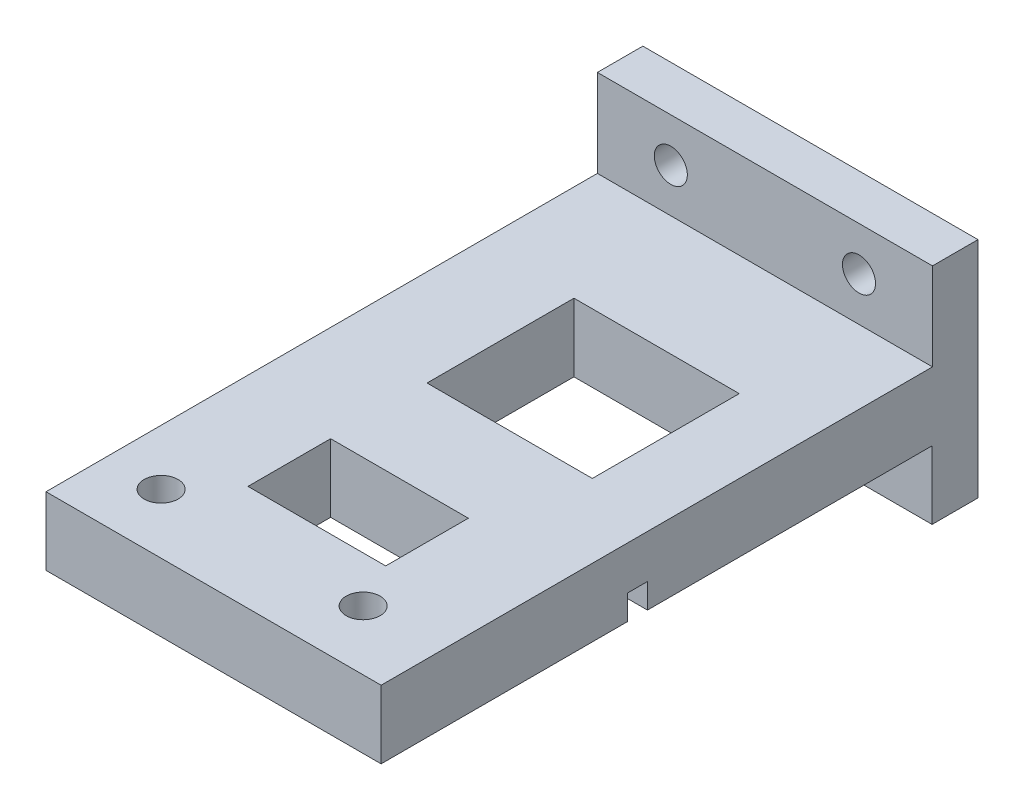
ISO-10303-21;
HEADER;
FILE_DESCRIPTION(('STEP AP214'),'2;1');
FILE_NAME('part.step','',(''),(''),'','','');
FILE_SCHEMA(('AUTOMOTIVE_DESIGN { 1 0 10303 214 1 1 1 1 }'));
ENDSEC;
DATA;
#1=APPLICATION_CONTEXT('core data for automotive mechanical design processes');
#2=APPLICATION_PROTOCOL_DEFINITION('international standard','automotive_design',2000,#1);
#3=PRODUCT_CONTEXT('',#1,'mechanical');
#4=PRODUCT('Part','Part','',(#3));
#5=PRODUCT_RELATED_PRODUCT_CATEGORY('part','',(#4));
#6=PRODUCT_DEFINITION_FORMATION('','',#4);
#7=PRODUCT_DEFINITION_CONTEXT('part definition',#1,'design');
#8=PRODUCT_DEFINITION('design','',#6,#7);
#9=PRODUCT_DEFINITION_SHAPE('','',#8);
#10=(LENGTH_UNIT() NAMED_UNIT(*) SI_UNIT(.MILLI.,.METRE.));
#11=(NAMED_UNIT(*) PLANE_ANGLE_UNIT() SI_UNIT($,.RADIAN.));
#12=(NAMED_UNIT(*) SI_UNIT($,.STERADIAN.) SOLID_ANGLE_UNIT());
#13=UNCERTAINTY_MEASURE_WITH_UNIT(LENGTH_MEASURE(1.E-05),#10,'distance_accuracy_value','');
#14=(GEOMETRIC_REPRESENTATION_CONTEXT(3) GLOBAL_UNCERTAINTY_ASSIGNED_CONTEXT((#13)) GLOBAL_UNIT_ASSIGNED_CONTEXT((#10,
#11,#12)) REPRESENTATION_CONTEXT('',''));
#15=CARTESIAN_POINT('',(0.,0.,0.));
#16=DIRECTION('',(0.,0.,1.));
#17=DIRECTION('',(1.,0.,0.));
#18=AXIS2_PLACEMENT_3D('',#15,#16,#17);
#19=CARTESIAN_POINT('',(0.,0.,29.7));
#20=DIRECTION('',(0.,0.,1.));
#21=DIRECTION('',(1.,0.,0.));
#22=AXIS2_PLACEMENT_3D('',#19,#20,#21);
#23=PLANE('',#22);
#24=DIRECTION('',(-1.,0.,0.));
#25=VECTOR('',#24,1.);
#26=CARTESIAN_POINT('',(-6.61487977012399,-135.86462945309,29.7));
#27=LINE('',#26,#25);
#28=CARTESIAN_POINT('',(29.8795748109975,-135.86462945309,29.7));
#29=VERTEX_POINT('',#28);
#30=CARTESIAN_POINT('',(-6.61487977012399,-135.86462945309,29.7));
#31=VERTEX_POINT('',#30);
#32=EDGE_CURVE('E333',#29,#31,#27,.T.);
#33=ORIENTED_EDGE('',*,*,#32,.F.);
#34=DIRECTION('',(0.,1.,0.));
#35=VECTOR('',#34,1.);
#36=CARTESIAN_POINT('',(29.8795748109975,-135.86462945309,29.7));
#37=LINE('',#36,#35);
#38=CARTESIAN_POINT('',(29.8795748109975,-150.703034062997,29.7));
#39=VERTEX_POINT('',#38);
#40=EDGE_CURVE('E336',#39,#29,#37,.T.);
#41=ORIENTED_EDGE('',*,*,#40,.F.);
#42=DIRECTION('',(1.,0.,0.));
#43=VECTOR('',#42,1.);
#44=CARTESIAN_POINT('',(-6.61487977012399,-150.703034062997,29.7));
#45=LINE('',#44,#43);
#46=CARTESIAN_POINT('',(-6.61487977012399,-150.703034062997,29.7));
#47=VERTEX_POINT('',#46);
#48=EDGE_CURVE('E340',#47,#39,#45,.T.);
#49=ORIENTED_EDGE('',*,*,#48,.F.);
#50=DIRECTION('',(0.,-1.,0.));
#51=VECTOR('',#50,1.);
#52=CARTESIAN_POINT('',(-6.61487977012399,-135.86462945309,29.7));
#53=LINE('',#52,#51);
#54=EDGE_CURVE('E343',#31,#47,#53,.T.);
#55=ORIENTED_EDGE('',*,*,#54,.F.);
#56=EDGE_LOOP('',(#33,#41,#49,#55));
#57=FACE_BOUND('',#56,.T.);
#58=ADVANCED_FACE('F38',(#57),#23,.F.);
#59=CARTESIAN_POINT('',(-6.61487977012399,-135.86462945309,74.0957290393366));
#60=DIRECTION('',(0.,-1.,0.));
#61=DIRECTION('',(0.,0.,-1.));
#62=AXIS2_PLACEMENT_3D('',#59,#60,#61);
#63=PLANE('',#62);
#64=CARTESIAN_POINT('',(21.4220309120393,-135.86462945309,88.2));
#65=DIRECTION('',(0.,-1.,0.));
#66=DIRECTION('',(0.,0.,-1.));
#67=AXIS2_PLACEMENT_3D('',#64,#65,#66);
#68=CIRCLE('',#67,1.85);
#69=CARTESIAN_POINT('',(21.4220309120393,-135.86462945309,86.35));
#70=VERTEX_POINT('',#69);
#71=EDGE_CURVE('E287',#70,#70,#68,.T.);
#72=ORIENTED_EDGE('',*,*,#71,.T.);
#73=EDGE_LOOP('',(#72));
#74=FACE_BOUND('',#73,.T.);
#75=CARTESIAN_POINT('',(-0.577969087960695,-135.86462945309,88.2));
#76=DIRECTION('',(0.,-1.,0.));
#77=DIRECTION('',(0.,0.,-1.));
#78=AXIS2_PLACEMENT_3D('',#75,#76,#77);
#79=CIRCLE('',#78,1.85);
#80=CARTESIAN_POINT('',(-0.577969087960695,-135.86462945309,86.35));
#81=VERTEX_POINT('',#80);
#82=EDGE_CURVE('E293',#81,#81,#79,.T.);
#83=ORIENTED_EDGE('',*,*,#82,.T.);
#84=EDGE_LOOP('',(#83));
#85=FACE_BOUND('',#84,.T.);
#86=DIRECTION('',(-1.,0.,0.));
#87=VECTOR('',#86,1.);
#88=CARTESIAN_POINT('',(3.87957481099747,-135.86462945309,47.7000000000001));
#89=LINE('',#88,#87);
#90=CARTESIAN_POINT('',(21.8795748109975,-135.86462945309,47.7000000000001));
#91=VERTEX_POINT('',#90);
#92=CARTESIAN_POINT('',(3.87957481099747,-135.86462945309,47.7000000000001));
#93=VERTEX_POINT('',#92);
#94=EDGE_CURVE('E255',#91,#93,#89,.T.);
#95=ORIENTED_EDGE('',*,*,#94,.F.);
#96=DIRECTION('',(0.,0.,-1.));
#97=VECTOR('',#96,1.);
#98=CARTESIAN_POINT('',(21.8795748109975,-135.86462945309,47.7000000000001));
#99=LINE('',#98,#97);
#100=CARTESIAN_POINT('',(21.8795748109975,-135.86462945309,63.7000000000001));
#101=VERTEX_POINT('',#100);
#102=EDGE_CURVE('E231',#101,#91,#99,.T.);
#103=ORIENTED_EDGE('',*,*,#102,.F.);
#104=DIRECTION('',(1.,0.,0.));
#105=VECTOR('',#104,1.);
#106=CARTESIAN_POINT('',(3.87957481099747,-135.86462945309,63.7000000000001));
#107=LINE('',#106,#105);
#108=CARTESIAN_POINT('',(3.87957481099747,-135.86462945309,63.7000000000001));
#109=VERTEX_POINT('',#108);
#110=EDGE_CURVE('E261',#109,#101,#107,.T.);
#111=ORIENTED_EDGE('',*,*,#110,.F.);
#112=DIRECTION('',(0.,0.,1.));
#113=VECTOR('',#112,1.);
#114=CARTESIAN_POINT('',(3.87957481099747,-135.86462945309,47.7000000000001));
#115=LINE('',#114,#113);
#116=EDGE_CURVE('E258',#93,#109,#115,.T.);
#117=ORIENTED_EDGE('',*,*,#116,.F.);
#118=EDGE_LOOP('',(#95,#103,#111,#117));
#119=FACE_BOUND('',#118,.T.);
#120=DIRECTION('',(-1.,0.,0.));
#121=VECTOR('',#120,1.);
#122=CARTESIAN_POINT('',(3.87957481099747,-135.86462945309,74.2000000000001));
#123=LINE('',#122,#121);
#124=CARTESIAN_POINT('',(18.8795748109975,-135.86462945309,74.2000000000001));
#125=VERTEX_POINT('',#124);
#126=CARTESIAN_POINT('',(3.87957481099747,-135.86462945309,74.2000000000001));
#127=VERTEX_POINT('',#126);
#128=EDGE_CURVE('E234',#125,#127,#123,.T.);
#129=ORIENTED_EDGE('',*,*,#128,.F.);
#130=DIRECTION('',(0.,0.,-1.));
#131=VECTOR('',#130,1.);
#132=CARTESIAN_POINT('',(18.8795748109975,-135.86462945309,74.2000000000001));
#133=LINE('',#132,#131);
#134=CARTESIAN_POINT('',(18.8795748109975,-135.86462945309,83.2));
#135=VERTEX_POINT('',#134);
#136=EDGE_CURVE('E232',#135,#125,#133,.T.);
#137=ORIENTED_EDGE('',*,*,#136,.F.);
#138=DIRECTION('',(1.,0.,0.));
#139=VECTOR('',#138,1.);
#140=CARTESIAN_POINT('',(3.87957481099747,-135.86462945309,83.2));
#141=LINE('',#140,#139);
#142=CARTESIAN_POINT('',(3.87957481099747,-135.86462945309,83.2));
#143=VERTEX_POINT('',#142);
#144=EDGE_CURVE('E241',#143,#135,#141,.T.);
#145=ORIENTED_EDGE('',*,*,#144,.F.);
#146=DIRECTION('',(0.,0.,1.));
#147=VECTOR('',#146,1.);
#148=CARTESIAN_POINT('',(3.87957481099747,-135.86462945309,74.2000000000001));
#149=LINE('',#148,#147);
#150=EDGE_CURVE('E238',#127,#143,#149,.T.);
#151=ORIENTED_EDGE('',*,*,#150,.F.);
#152=EDGE_LOOP('',(#129,#137,#145,#151));
#153=FACE_BOUND('',#152,.T.);
#154=DIRECTION('',(0.,0.,-1.));
#155=VECTOR('',#154,1.);
#156=CARTESIAN_POINT('',(29.8795748109975,-135.86462945309,74.0957290393366));
#157=LINE('',#156,#155);
#158=CARTESIAN_POINT('',(29.8795748109975,-135.86462945309,94.7000000000001));
#159=VERTEX_POINT('',#158);
#160=CARTESIAN_POINT('',(29.8795748109975,-135.86462945309,34.657229822533));
#161=VERTEX_POINT('',#160);
#162=EDGE_CURVE('E54',#159,#161,#157,.T.);
#163=ORIENTED_EDGE('',*,*,#162,.T.);
#164=DIRECTION('',(-1.,0.,0.));
#165=VECTOR('',#164,1.);
#166=CARTESIAN_POINT('',(40.6172044744316,-135.86462945309,34.657229822533));
#167=LINE('',#166,#165);
#168=CARTESIAN_POINT('',(-6.61487977012399,-135.86462945309,34.657229822533));
#169=VERTEX_POINT('',#168);
#170=EDGE_CURVE('E223',#161,#169,#167,.T.);
#171=ORIENTED_EDGE('',*,*,#170,.T.);
#172=DIRECTION('',(0.,0.,-1.));
#173=VECTOR('',#172,1.);
#174=CARTESIAN_POINT('',(-6.61487977012399,-135.86462945309,74.0957290393366));
#175=LINE('',#174,#173);
#176=CARTESIAN_POINT('',(-6.61487977012399,-135.86462945309,94.7000000000001));
#177=VERTEX_POINT('',#176);
#178=EDGE_CURVE('E215',#177,#169,#175,.T.);
#179=ORIENTED_EDGE('',*,*,#178,.F.);
#180=DIRECTION('',(-1.,0.,0.));
#181=VECTOR('',#180,1.);
#182=CARTESIAN_POINT('',(-6.61487977012399,-135.86462945309,94.7000000000001));
#183=LINE('',#182,#181);
#184=EDGE_CURVE('E320',#159,#177,#183,.T.);
#185=ORIENTED_EDGE('',*,*,#184,.F.);
#186=EDGE_LOOP('',(#163,#171,#179,#185));
#187=FACE_BOUND('',#186,.T.);
#188=ADVANCED_FACE('F390',(#74,#85,#119,#153,#187),#63,.F.);
#189=CARTESIAN_POINT('',(-6.61487977012399,-143.283831758044,94.7000000000001));
#190=DIRECTION('',(0.,1.,0.));
#191=DIRECTION('',(0.,0.,1.));
#192=AXIS2_PLACEMENT_3D('',#189,#190,#191);
#193=PLANE('',#192);
#194=DIRECTION('',(1.,0.,0.));
#195=VECTOR('',#194,1.);
#196=CARTESIAN_POINT('',(-6.61487977012399,-143.283831758044,83.2));
#197=LINE('',#196,#195);
#198=CARTESIAN_POINT('',(3.87957481099747,-143.283831758044,83.2));
#199=VERTEX_POINT('',#198);
#200=CARTESIAN_POINT('',(18.8795748109975,-143.283831758044,83.2));
#201=VERTEX_POINT('',#200);
#202=EDGE_CURVE('E277',#199,#201,#197,.T.);
#203=ORIENTED_EDGE('',*,*,#202,.T.);
#204=DIRECTION('',(0.,0.,-1.));
#205=VECTOR('',#204,1.);
#206=CARTESIAN_POINT('',(18.8795748109975,-143.283831758044,94.7000000000001));
#207=LINE('',#206,#205);
#208=CARTESIAN_POINT('',(18.8795748109975,-143.283831758044,74.2000000000001));
#209=VERTEX_POINT('',#208);
#210=EDGE_CURVE('E280',#201,#209,#207,.T.);
#211=ORIENTED_EDGE('',*,*,#210,.T.);
#212=DIRECTION('',(-1.,0.,0.));
#213=VECTOR('',#212,1.);
#214=CARTESIAN_POINT('',(-6.61487977012399,-143.283831758044,74.2000000000001));
#215=LINE('',#214,#213);
#216=CARTESIAN_POINT('',(3.87957481099747,-143.283831758044,74.2000000000001));
#217=VERTEX_POINT('',#216);
#218=EDGE_CURVE('E247',#209,#217,#215,.T.);
#219=ORIENTED_EDGE('',*,*,#218,.T.);
#220=DIRECTION('',(0.,0.,1.));
#221=VECTOR('',#220,1.);
#222=CARTESIAN_POINT('',(3.87957481099747,-143.283831758044,94.7000000000001));
#223=LINE('',#222,#221);
#224=EDGE_CURVE('E274',#217,#199,#223,.T.);
#225=ORIENTED_EDGE('',*,*,#224,.T.);
#226=EDGE_LOOP('',(#203,#211,#219,#225));
#227=FACE_BOUND('',#226,.T.);
#228=CARTESIAN_POINT('',(-0.577969087960695,-143.283831758044,88.2));
#229=DIRECTION('',(0.,-1.,0.));
#230=DIRECTION('',(0.,0.,-1.));
#231=AXIS2_PLACEMENT_3D('',#228,#229,#230);
#232=CIRCLE('',#231,1.85);
#233=CARTESIAN_POINT('',(-0.577969087960695,-143.283831758044,86.35));
#234=VERTEX_POINT('',#233);
#235=EDGE_CURVE('E284',#234,#234,#232,.T.);
#236=ORIENTED_EDGE('',*,*,#235,.F.);
#237=EDGE_LOOP('',(#236));
#238=FACE_BOUND('',#237,.T.);
#239=CARTESIAN_POINT('',(21.4220309120393,-143.283831758044,88.2));
#240=DIRECTION('',(0.,-1.,0.));
#241=DIRECTION('',(0.,0.,-1.));
#242=AXIS2_PLACEMENT_3D('',#239,#240,#241);
#243=CIRCLE('',#242,1.85);
#244=CARTESIAN_POINT('',(21.4220309120393,-143.283831758044,86.35));
#245=VERTEX_POINT('',#244);
#246=EDGE_CURVE('E283',#245,#245,#243,.T.);
#247=ORIENTED_EDGE('',*,*,#246,.F.);
#248=EDGE_LOOP('',(#247));
#249=FACE_BOUND('',#248,.T.);
#250=DIRECTION('',(0.,0.,-1.));
#251=VECTOR('',#250,1.);
#252=CARTESIAN_POINT('',(-6.61487977012399,-143.283831758044,94.7000000000001));
#253=LINE('',#252,#251);
#254=CARTESIAN_POINT('',(-6.61487977012399,-143.283831758044,94.7000000000001));
#255=VERTEX_POINT('',#254);
#256=CARTESIAN_POINT('',(-6.61487977012398,-143.283831758044,67.8926806607099));
#257=VERTEX_POINT('',#256);
#258=EDGE_CURVE('E330',#255,#257,#253,.T.);
#259=ORIENTED_EDGE('',*,*,#258,.T.);
#260=DIRECTION('',(1.,0.,0.));
#261=VECTOR('',#260,1.);
#262=CARTESIAN_POINT('',(-6.61487977012399,-143.283831758044,67.8926806607099));
#263=LINE('',#262,#261);
#264=CARTESIAN_POINT('',(29.8795748109975,-143.283831758044,67.8926806607099));
#265=VERTEX_POINT('',#264);
#266=EDGE_CURVE('E361',#257,#265,#263,.T.);
#267=ORIENTED_EDGE('',*,*,#266,.T.);
#268=DIRECTION('',(0.,0.,-1.));
#269=VECTOR('',#268,1.);
#270=CARTESIAN_POINT('',(29.8795748109975,-143.283831758044,94.7000000000001));
#271=LINE('',#270,#269);
#272=CARTESIAN_POINT('',(29.8795748109975,-143.283831758044,94.7000000000001));
#273=VERTEX_POINT('',#272);
#274=EDGE_CURVE('E326',#273,#265,#271,.T.);
#275=ORIENTED_EDGE('',*,*,#274,.F.);
#276=DIRECTION('',(1.,0.,0.));
#277=VECTOR('',#276,1.);
#278=CARTESIAN_POINT('',(-6.61487977012399,-143.283831758044,94.7000000000001));
#279=LINE('',#278,#277);
#280=EDGE_CURVE('E315',#255,#273,#279,.T.);
#281=ORIENTED_EDGE('',*,*,#280,.F.);
#282=EDGE_LOOP('',(#259,#267,#275,#281));
#283=FACE_BOUND('',#282,.T.);
#284=ADVANCED_FACE('F395',(#227,#238,#249,#283),#193,.F.);
#285=CARTESIAN_POINT('',(-6.61487977012399,-135.86462945309,74.0957290393366));
#286=DIRECTION('',(1.,0.,0.));
#287=DIRECTION('',(0.,0.,-1.));
#288=AXIS2_PLACEMENT_3D('',#285,#286,#287);
#289=PLANE('',#288);
#290=DIRECTION('',(0.,0.,1.));
#291=VECTOR('',#290,1.);
#292=CARTESIAN_POINT('',(-6.61487977012399,-140.585777531945,74.0957290393366));
#293=LINE('',#292,#291);
#294=CARTESIAN_POINT('',(-6.61487977012398,-140.585777531945,65.6954548469845));
#295=VERTEX_POINT('',#294);
#296=CARTESIAN_POINT('',(-6.61487977012398,-140.585777531945,67.8926806607099));
#297=VERTEX_POINT('',#296);
#298=EDGE_CURVE('E309',#295,#297,#293,.T.);
#299=ORIENTED_EDGE('',*,*,#298,.T.);
#300=DIRECTION('',(0.,-1.,0.));
#301=VECTOR('',#300,1.);
#302=CARTESIAN_POINT('',(-6.61487977012399,-135.86462945309,67.8926806607099));
#303=LINE('',#302,#301);
#304=EDGE_CURVE('E306',#297,#257,#303,.T.);
#305=ORIENTED_EDGE('',*,*,#304,.T.);
#306=ORIENTED_EDGE('',*,*,#258,.F.);
#307=DIRECTION('',(0.,-1.,0.));
#308=VECTOR('',#307,1.);
#309=CARTESIAN_POINT('',(-6.61487977012399,-143.283831758044,94.7000000000001));
#310=LINE('',#309,#308);
#311=EDGE_CURVE('E312',#177,#255,#310,.T.);
#312=ORIENTED_EDGE('',*,*,#311,.F.);
#313=ORIENTED_EDGE('',*,*,#178,.T.);
#314=DIRECTION('',(0.,1.,0.));
#315=VECTOR('',#314,1.);
#316=CARTESIAN_POINT('',(-6.61487977012399,-135.86462945309,34.657229822533));
#317=LINE('',#316,#315);
#318=CARTESIAN_POINT('',(-6.61487977012399,-126.338442502593,34.657229822533));
#319=VERTEX_POINT('',#318);
#320=EDGE_CURVE('E196',#169,#319,#317,.T.);
#321=ORIENTED_EDGE('',*,*,#320,.T.);
#322=DIRECTION('',(0.,0.,-1.));
#323=VECTOR('',#322,1.);
#324=CARTESIAN_POINT('',(-6.61487977012399,-126.338442502593,34.657229822533));
#325=LINE('',#324,#323);
#326=CARTESIAN_POINT('',(-6.61487977012399,-126.338442502593,29.7025902823407));
#327=VERTEX_POINT('',#326);
#328=EDGE_CURVE('E204',#319,#327,#325,.T.);
#329=ORIENTED_EDGE('',*,*,#328,.T.);
#330=DIRECTION('',(0.,-1.,0.));
#331=VECTOR('',#330,1.);
#332=CARTESIAN_POINT('',(-6.61487977012399,-135.86462945309,29.7025902823407));
#333=LINE('',#332,#331);
#334=CARTESIAN_POINT('',(-6.61487977012399,-135.86462945309,29.7025902823407));
#335=VERTEX_POINT('',#334);
#336=EDGE_CURVE('E201',#327,#335,#333,.T.);
#337=ORIENTED_EDGE('',*,*,#336,.T.);
#338=EDGE_CURVE('E62',#335,#31,#175,.T.);
#339=ORIENTED_EDGE('',*,*,#338,.T.);
#340=ORIENTED_EDGE('',*,*,#54,.T.);
#341=DIRECTION('',(0.,0.,-1.));
#342=VECTOR('',#341,1.);
#343=CARTESIAN_POINT('',(-6.61487977012399,-150.703034062997,74.0957290393366));
#344=LINE('',#343,#342);
#345=CARTESIAN_POINT('',(-6.61487977012399,-150.703034062997,34.7));
#346=VERTEX_POINT('',#345);
#347=EDGE_CURVE('E342',#346,#47,#344,.T.);
#348=ORIENTED_EDGE('',*,*,#347,.F.);
#349=DIRECTION('',(0.,-1.,0.));
#350=VECTOR('',#349,1.);
#351=CARTESIAN_POINT('',(-6.61487977012399,-135.86462945309,34.7000000000001));
#352=LINE('',#351,#350);
#353=CARTESIAN_POINT('',(-6.61487977012399,-143.283831758044,34.7000000000001));
#354=VERTEX_POINT('',#353);
#355=EDGE_CURVE('E335',#354,#346,#352,.T.);
#356=ORIENTED_EDGE('',*,*,#355,.F.);
#357=CARTESIAN_POINT('',(-6.61487977012399,-143.283831758044,65.6954548469845));
#358=VERTEX_POINT('',#357);
#359=EDGE_CURVE('E329',#358,#354,#253,.T.);
#360=ORIENTED_EDGE('',*,*,#359,.F.);
#361=DIRECTION('',(0.,1.,0.));
#362=VECTOR('',#361,1.);
#363=CARTESIAN_POINT('',(-6.61487977012399,-135.86462945309,65.6954548469845));
#364=LINE('',#363,#362);
#365=EDGE_CURVE('E302',#358,#295,#364,.T.);
#366=ORIENTED_EDGE('',*,*,#365,.T.);
#367=EDGE_LOOP('',(#299,#305,#306,#312,#313,#321,#329,#337,#339,#340,#348,#356,#360,#366));
#368=FACE_BOUND('',#367,.T.);
#369=ADVANCED_FACE('F213',(#368),#289,.F.);
#370=CARTESIAN_POINT('',(-6.61487977012399,-150.703034062997,74.0957290393366));
#371=DIRECTION('',(0.,1.,0.));
#372=DIRECTION('',(0.,0.,1.));
#373=AXIS2_PLACEMENT_3D('',#370,#371,#372);
#374=PLANE('',#373);
#375=DIRECTION('',(1.,0.,0.));
#376=VECTOR('',#375,1.);
#377=CARTESIAN_POINT('',(-6.61487977012426,-150.703034062997,34.7000000000001));
#378=LINE('',#377,#376);
#379=CARTESIAN_POINT('',(29.8795748109975,-150.703034062997,34.6999999999999));
#380=VERTEX_POINT('',#379);
#381=EDGE_CURVE('E349',#346,#380,#378,.T.);
#382=ORIENTED_EDGE('',*,*,#381,.F.);
#383=ORIENTED_EDGE('',*,*,#347,.T.);
#384=ORIENTED_EDGE('',*,*,#48,.T.);
#385=DIRECTION('',(0.,0.,-1.));
#386=VECTOR('',#385,1.);
#387=CARTESIAN_POINT('',(29.8795748109975,-150.703034062997,74.0957290393366));
#388=LINE('',#387,#386);
#389=EDGE_CURVE('E339',#380,#39,#388,.T.);
#390=ORIENTED_EDGE('',*,*,#389,.F.);
#391=EDGE_LOOP('',(#382,#383,#384,#390));
#392=FACE_BOUND('',#391,.T.);
#393=ADVANCED_FACE('F420',(#392),#374,.F.);
#394=CARTESIAN_POINT('',(29.8795748109975,-135.86462945309,74.0957290393366));
#395=DIRECTION('',(-1.,0.,0.));
#396=DIRECTION('',(0.,-1.,0.));
#397=AXIS2_PLACEMENT_3D('',#394,#395,#396);
#398=PLANE('',#397);
#399=ORIENTED_EDGE('',*,*,#274,.T.);
#400=DIRECTION('',(0.,-1.,0.));
#401=VECTOR('',#400,1.);
#402=CARTESIAN_POINT('',(29.8795748109975,-143.283831758044,67.8926806607099));
#403=LINE('',#402,#401);
#404=CARTESIAN_POINT('',(29.8795748109975,-140.585777531945,67.8926806607099));
#405=VERTEX_POINT('',#404);
#406=EDGE_CURVE('E290',#405,#265,#403,.T.);
#407=ORIENTED_EDGE('',*,*,#406,.F.);
#408=DIRECTION('',(0.,0.,1.));
#409=VECTOR('',#408,1.);
#410=CARTESIAN_POINT('',(29.8795748109975,-140.585777531945,67.8926806607099));
#411=LINE('',#410,#409);
#412=CARTESIAN_POINT('',(29.8795748109975,-140.585777531945,65.6954548469845));
#413=VERTEX_POINT('',#412);
#414=EDGE_CURVE('E296',#413,#405,#411,.T.);
#415=ORIENTED_EDGE('',*,*,#414,.F.);
#416=DIRECTION('',(0.,1.,0.));
#417=VECTOR('',#416,1.);
#418=CARTESIAN_POINT('',(29.8795748109975,-143.283831758044,65.6954548469845));
#419=LINE('',#418,#417);
#420=CARTESIAN_POINT('',(29.8795748109975,-143.283831758044,65.6954548469845));
#421=VERTEX_POINT('',#420);
#422=EDGE_CURVE('E292',#421,#413,#419,.T.);
#423=ORIENTED_EDGE('',*,*,#422,.F.);
#424=CARTESIAN_POINT('',(29.8795748109975,-143.283831758044,34.7000000000001));
#425=VERTEX_POINT('',#424);
#426=EDGE_CURVE('E323',#421,#425,#271,.T.);
#427=ORIENTED_EDGE('',*,*,#426,.T.);
#428=DIRECTION('',(0.,1.,0.));
#429=VECTOR('',#428,1.);
#430=CARTESIAN_POINT('',(29.8795748109975,-135.86462945309,34.6999999999998));
#431=LINE('',#430,#429);
#432=EDGE_CURVE('E345',#380,#425,#431,.T.);
#433=ORIENTED_EDGE('',*,*,#432,.F.);
#434=ORIENTED_EDGE('',*,*,#389,.T.);
#435=ORIENTED_EDGE('',*,*,#40,.T.);
#436=CARTESIAN_POINT('',(29.8795748109975,-135.86462945309,29.7025902823407));
#437=VERTEX_POINT('',#436);
#438=EDGE_CURVE('E338',#437,#29,#157,.T.);
#439=ORIENTED_EDGE('',*,*,#438,.F.);
#440=DIRECTION('',(0.,1.,0.));
#441=VECTOR('',#440,1.);
#442=CARTESIAN_POINT('',(29.8795748109975,-135.86462945309,29.7025902823407));
#443=LINE('',#442,#441);
#444=CARTESIAN_POINT('',(29.8795748109975,-126.338442502593,29.7025902823407));
#445=VERTEX_POINT('',#444);
#446=EDGE_CURVE('E225',#437,#445,#443,.T.);
#447=ORIENTED_EDGE('',*,*,#446,.T.);
#448=DIRECTION('',(0.,0.,1.));
#449=VECTOR('',#448,1.);
#450=CARTESIAN_POINT('',(29.8795748109975,-126.338442502593,34.657229822533));
#451=LINE('',#450,#449);
#452=CARTESIAN_POINT('',(29.8795748109975,-126.338442502593,34.657229822533));
#453=VERTEX_POINT('',#452);
#454=EDGE_CURVE('E229',#445,#453,#451,.T.);
#455=ORIENTED_EDGE('',*,*,#454,.T.);
#456=DIRECTION('',(0.,-1.,0.));
#457=VECTOR('',#456,1.);
#458=CARTESIAN_POINT('',(29.8795748109975,-135.86462945309,34.657229822533));
#459=LINE('',#458,#457);
#460=EDGE_CURVE('E197',#453,#161,#459,.T.);
#461=ORIENTED_EDGE('',*,*,#460,.T.);
#462=ORIENTED_EDGE('',*,*,#162,.F.);
#463=DIRECTION('',(0.,1.,0.));
#464=VECTOR('',#463,1.);
#465=CARTESIAN_POINT('',(29.8795748109975,-143.283831758044,94.7000000000001));
#466=LINE('',#465,#464);
#467=EDGE_CURVE('E317',#273,#159,#466,.T.);
#468=ORIENTED_EDGE('',*,*,#467,.F.);
#469=EDGE_LOOP('',(#399,#407,#415,#423,#427,#433,#434,#435,#439,#447,#455,#461,#462,#468));
#470=FACE_BOUND('',#469,.T.);
#471=ADVANCED_FACE('F388',(#470),#398,.F.);
#472=ORIENTED_EDGE('',*,*,#338,.F.);
#473=DIRECTION('',(-1.,0.,0.));
#474=VECTOR('',#473,1.);
#475=CARTESIAN_POINT('',(40.6172044744316,-135.86462945309,29.7025902823407));
#476=LINE('',#475,#474);
#477=EDGE_CURVE('E226',#437,#335,#476,.T.);
#478=ORIENTED_EDGE('',*,*,#477,.F.);
#479=ORIENTED_EDGE('',*,*,#438,.T.);
#480=ORIENTED_EDGE('',*,*,#32,.T.);
#481=EDGE_LOOP('',(#472,#478,#479,#480));
#482=FACE_BOUND('',#481,.T.);
#483=ADVANCED_FACE('F426',(#482),#63,.F.);
#484=CARTESIAN_POINT('',(11.3419801516968,-189.849114558127,34.7));
#485=DIRECTION('',(0.,0.,1.));
#486=DIRECTION('',(0.,-1.,0.));
#487=AXIS2_PLACEMENT_3D('',#484,#485,#486);
#488=PLANE('',#487);
#489=DIRECTION('',(1.,0.,0.));
#490=VECTOR('',#489,1.);
#491=CARTESIAN_POINT('',(-6.61487977012399,-143.283831758044,34.7000000000001));
#492=LINE('',#491,#490);
#493=EDGE_CURVE('E311',#354,#425,#492,.T.);
#494=ORIENTED_EDGE('',*,*,#493,.F.);
#495=ORIENTED_EDGE('',*,*,#355,.T.);
#496=ORIENTED_EDGE('',*,*,#381,.T.);
#497=ORIENTED_EDGE('',*,*,#432,.T.);
#498=EDGE_LOOP('',(#494,#495,#496,#497));
#499=FACE_BOUND('',#498,.T.);
#500=ADVANCED_FACE('F415',(#499),#488,.T.);
#501=DIRECTION('',(1.,0.,0.));
#502=VECTOR('',#501,1.);
#503=CARTESIAN_POINT('',(-6.61487977012399,-143.283831758044,63.7000000000001));
#504=LINE('',#503,#502);
#505=CARTESIAN_POINT('',(3.87957481099747,-143.283831758044,63.7000000000001));
#506=VERTEX_POINT('',#505);
#507=CARTESIAN_POINT('',(21.8795748109975,-143.283831758044,63.7000000000001));
#508=VERTEX_POINT('',#507);
#509=EDGE_CURVE('E46',#506,#508,#504,.T.);
#510=ORIENTED_EDGE('',*,*,#509,.T.);
#511=DIRECTION('',(0.,0.,-1.));
#512=VECTOR('',#511,1.);
#513=CARTESIAN_POINT('',(21.8795748109975,-143.283831758044,94.7000000000001));
#514=LINE('',#513,#512);
#515=CARTESIAN_POINT('',(21.8795748109975,-143.283831758044,47.7000000000001));
#516=VERTEX_POINT('',#515);
#517=EDGE_CURVE('E11',#508,#516,#514,.T.);
#518=ORIENTED_EDGE('',*,*,#517,.T.);
#519=DIRECTION('',(-1.,0.,0.));
#520=VECTOR('',#519,1.);
#521=CARTESIAN_POINT('',(-6.614879770124,-143.283831758044,47.7000000000001));
#522=LINE('',#521,#520);
#523=CARTESIAN_POINT('',(3.87957481099747,-143.283831758044,47.7000000000001));
#524=VERTEX_POINT('',#523);
#525=EDGE_CURVE('E364',#516,#524,#522,.T.);
#526=ORIENTED_EDGE('',*,*,#525,.T.);
#527=DIRECTION('',(0.,0.,1.));
#528=VECTOR('',#527,1.);
#529=CARTESIAN_POINT('',(3.87957481099747,-143.283831758044,94.7000000000001));
#530=LINE('',#529,#528);
#531=EDGE_CURVE('E371',#524,#506,#530,.T.);
#532=ORIENTED_EDGE('',*,*,#531,.T.);
#533=EDGE_LOOP('',(#510,#518,#526,#532));
#534=FACE_BOUND('',#533,.T.);
#535=ORIENTED_EDGE('',*,*,#426,.F.);
#536=DIRECTION('',(-1.,0.,0.));
#537=VECTOR('',#536,1.);
#538=CARTESIAN_POINT('',(-6.61487977012399,-143.283831758044,65.6954548469845));
#539=LINE('',#538,#537);
#540=EDGE_CURVE('E348',#421,#358,#539,.T.);
#541=ORIENTED_EDGE('',*,*,#540,.T.);
#542=ORIENTED_EDGE('',*,*,#359,.T.);
#543=ORIENTED_EDGE('',*,*,#493,.T.);
#544=EDGE_LOOP('',(#535,#541,#542,#543));
#545=FACE_BOUND('',#544,.T.);
#546=ADVANCED_FACE('F410',(#534,#545),#193,.F.);
#547=CARTESIAN_POINT('',(0.,0.,94.7000000000001));
#548=DIRECTION('',(0.,0.,-1.));
#549=DIRECTION('',(-1.,0.,0.));
#550=AXIS2_PLACEMENT_3D('',#547,#548,#549);
#551=PLANE('',#550);
#552=ORIENTED_EDGE('',*,*,#311,.T.);
#553=ORIENTED_EDGE('',*,*,#280,.T.);
#554=ORIENTED_EDGE('',*,*,#467,.T.);
#555=ORIENTED_EDGE('',*,*,#184,.T.);
#556=EDGE_LOOP('',(#552,#553,#554,#555));
#557=FACE_BOUND('',#556,.T.);
#558=ADVANCED_FACE('F392',(#557),#551,.F.);
#559=CARTESIAN_POINT('',(-47.0807870095855,-140.585777531945,67.8926806607099));
#560=DIRECTION('',(0.,1.,0.));
#561=DIRECTION('',(-1.,0.,0.));
#562=AXIS2_PLACEMENT_3D('',#559,#560,#561);
#563=PLANE('',#562);
#564=DIRECTION('',(1.,0.,0.));
#565=VECTOR('',#564,1.);
#566=CARTESIAN_POINT('',(-47.0807870095855,-140.585777531945,65.6954548469845));
#567=LINE('',#566,#565);
#568=EDGE_CURVE('E299',#295,#413,#567,.T.);
#569=ORIENTED_EDGE('',*,*,#568,.T.);
#570=ORIENTED_EDGE('',*,*,#414,.T.);
#571=DIRECTION('',(1.,0.,0.));
#572=VECTOR('',#571,1.);
#573=CARTESIAN_POINT('',(-47.0807870095855,-140.585777531945,67.8926806607099));
#574=LINE('',#573,#572);
#575=EDGE_CURVE('E300',#297,#405,#574,.T.);
#576=ORIENTED_EDGE('',*,*,#575,.F.);
#577=ORIENTED_EDGE('',*,*,#298,.F.);
#578=EDGE_LOOP('',(#569,#570,#576,#577));
#579=FACE_BOUND('',#578,.T.);
#580=ADVANCED_FACE('F404',(#579),#563,.F.);
#581=CARTESIAN_POINT('',(-47.0807870095855,-143.283831758044,67.8926806607099));
#582=DIRECTION('',(0.,0.,1.));
#583=DIRECTION('',(1.,0.,0.));
#584=AXIS2_PLACEMENT_3D('',#581,#582,#583);
#585=PLANE('',#584);
#586=ORIENTED_EDGE('',*,*,#575,.T.);
#587=ORIENTED_EDGE('',*,*,#406,.T.);
#588=ORIENTED_EDGE('',*,*,#266,.F.);
#589=ORIENTED_EDGE('',*,*,#304,.F.);
#590=EDGE_LOOP('',(#586,#587,#588,#589));
#591=FACE_BOUND('',#590,.T.);
#592=ADVANCED_FACE('F401',(#591),#585,.F.);
#593=CARTESIAN_POINT('',(-47.0807870095855,-143.283831758044,65.6954548469845));
#594=DIRECTION('',(0.,0.,-1.));
#595=DIRECTION('',(-1.,0.,0.));
#596=AXIS2_PLACEMENT_3D('',#593,#594,#595);
#597=PLANE('',#596);
#598=ORIENTED_EDGE('',*,*,#540,.F.);
#599=ORIENTED_EDGE('',*,*,#422,.T.);
#600=ORIENTED_EDGE('',*,*,#568,.F.);
#601=ORIENTED_EDGE('',*,*,#365,.F.);
#602=EDGE_LOOP('',(#598,#599,#600,#601));
#603=FACE_BOUND('',#602,.T.);
#604=ADVANCED_FACE('F407',(#603),#597,.F.);
#605=CARTESIAN_POINT('',(21.4220309120393,-123.401835220685,88.2));
#606=DIRECTION('',(0.,-1.,0.));
#607=DIRECTION('',(0.,0.,-1.));
#608=AXIS2_PLACEMENT_3D('',#605,#606,#607);
#609=CYLINDRICAL_SURFACE('',#608,1.85);
#610=ORIENTED_EDGE('',*,*,#246,.T.);
#611=EDGE_LOOP('',(#610));
#612=FACE_BOUND('',#611,.T.);
#613=ORIENTED_EDGE('',*,*,#71,.F.);
#614=EDGE_LOOP('',(#613));
#615=FACE_BOUND('',#614,.T.);
#616=ADVANCED_FACE('F569',(#612,#615),#609,.F.);
#617=CARTESIAN_POINT('',(-0.577969087960695,-123.401835220685,88.2));
#618=DIRECTION('',(0.,-1.,0.));
#619=DIRECTION('',(0.,0.,-1.));
#620=AXIS2_PLACEMENT_3D('',#617,#618,#619);
#621=CYLINDRICAL_SURFACE('',#620,1.85);
#622=ORIENTED_EDGE('',*,*,#235,.T.);
#623=EDGE_LOOP('',(#622));
#624=FACE_BOUND('',#623,.T.);
#625=ORIENTED_EDGE('',*,*,#82,.F.);
#626=EDGE_LOOP('',(#625));
#627=FACE_BOUND('',#626,.T.);
#628=ADVANCED_FACE('F559',(#624,#627),#621,.F.);
#629=CARTESIAN_POINT('',(21.8795748109975,-145.864629453091,47.7000000000001));
#630=DIRECTION('',(1.,0.,0.));
#631=DIRECTION('',(0.,0.,-1.));
#632=AXIS2_PLACEMENT_3D('',#629,#630,#631);
#633=PLANE('',#632);
#634=DIRECTION('',(0.,1.,0.));
#635=VECTOR('',#634,1.);
#636=CARTESIAN_POINT('',(21.8795748109975,-145.864629453091,63.7000000000001));
#637=LINE('',#636,#635);
#638=EDGE_CURVE('E235',#508,#101,#637,.T.);
#639=ORIENTED_EDGE('',*,*,#638,.T.);
#640=ORIENTED_EDGE('',*,*,#102,.T.);
#641=DIRECTION('',(0.,1.,0.));
#642=VECTOR('',#641,1.);
#643=CARTESIAN_POINT('',(21.8795748109975,-145.864629453091,47.7000000000001));
#644=LINE('',#643,#642);
#645=EDGE_CURVE('E264',#516,#91,#644,.T.);
#646=ORIENTED_EDGE('',*,*,#645,.F.);
#647=ORIENTED_EDGE('',*,*,#517,.F.);
#648=EDGE_LOOP('',(#639,#640,#646,#647));
#649=FACE_BOUND('',#648,.T.);
#650=ADVANCED_FACE('F550',(#649),#633,.F.);
#651=CARTESIAN_POINT('',(3.87957481099747,-145.864629453091,63.7000000000001));
#652=DIRECTION('',(0.,0.,1.));
#653=DIRECTION('',(1.,0.,0.));
#654=AXIS2_PLACEMENT_3D('',#651,#652,#653);
#655=PLANE('',#654);
#656=DIRECTION('',(0.,1.,0.));
#657=VECTOR('',#656,1.);
#658=CARTESIAN_POINT('',(3.87957481099747,-145.864629453091,63.7000000000001));
#659=LINE('',#658,#657);
#660=EDGE_CURVE('E266',#506,#109,#659,.T.);
#661=ORIENTED_EDGE('',*,*,#660,.T.);
#662=ORIENTED_EDGE('',*,*,#110,.T.);
#663=ORIENTED_EDGE('',*,*,#638,.F.);
#664=ORIENTED_EDGE('',*,*,#509,.F.);
#665=EDGE_LOOP('',(#661,#662,#663,#664));
#666=FACE_BOUND('',#665,.T.);
#667=ADVANCED_FACE('F541',(#666),#655,.F.);
#668=CARTESIAN_POINT('',(3.87957481099747,-145.864629453091,47.7000000000001));
#669=DIRECTION('',(-1.,0.,0.));
#670=DIRECTION('',(0.,0.,1.));
#671=AXIS2_PLACEMENT_3D('',#668,#669,#670);
#672=PLANE('',#671);
#673=DIRECTION('',(0.,1.,0.));
#674=VECTOR('',#673,1.);
#675=CARTESIAN_POINT('',(3.87957481099747,-145.864629453091,47.7000000000001));
#676=LINE('',#675,#674);
#677=EDGE_CURVE('E268',#524,#93,#676,.T.);
#678=ORIENTED_EDGE('',*,*,#677,.T.);
#679=ORIENTED_EDGE('',*,*,#116,.T.);
#680=ORIENTED_EDGE('',*,*,#660,.F.);
#681=ORIENTED_EDGE('',*,*,#531,.F.);
#682=EDGE_LOOP('',(#678,#679,#680,#681));
#683=FACE_BOUND('',#682,.T.);
#684=ADVANCED_FACE('F530',(#683),#672,.F.);
#685=CARTESIAN_POINT('',(3.87957481099747,-145.864629453091,47.7000000000001));
#686=DIRECTION('',(0.,0.,-1.));
#687=DIRECTION('',(-1.,0.,0.));
#688=AXIS2_PLACEMENT_3D('',#685,#686,#687);
#689=PLANE('',#688);
#690=ORIENTED_EDGE('',*,*,#645,.T.);
#691=ORIENTED_EDGE('',*,*,#94,.T.);
#692=ORIENTED_EDGE('',*,*,#677,.F.);
#693=ORIENTED_EDGE('',*,*,#525,.F.);
#694=EDGE_LOOP('',(#690,#691,#692,#693));
#695=FACE_BOUND('',#694,.T.);
#696=ADVANCED_FACE('F519',(#695),#689,.F.);
#697=CARTESIAN_POINT('',(18.8795748109975,-145.864629453091,74.2000000000001));
#698=DIRECTION('',(1.,0.,0.));
#699=DIRECTION('',(0.,0.,-1.));
#700=AXIS2_PLACEMENT_3D('',#697,#698,#699);
#701=PLANE('',#700);
#702=DIRECTION('',(0.,1.,0.));
#703=VECTOR('',#702,1.);
#704=CARTESIAN_POINT('',(18.8795748109975,-145.864629453091,83.2));
#705=LINE('',#704,#703);
#706=EDGE_CURVE('E245',#201,#135,#705,.T.);
#707=ORIENTED_EDGE('',*,*,#706,.T.);
#708=ORIENTED_EDGE('',*,*,#136,.T.);
#709=DIRECTION('',(0.,1.,0.));
#710=VECTOR('',#709,1.);
#711=CARTESIAN_POINT('',(18.8795748109975,-145.864629453091,74.2000000000001));
#712=LINE('',#711,#710);
#713=EDGE_CURVE('E244',#209,#125,#712,.T.);
#714=ORIENTED_EDGE('',*,*,#713,.F.);
#715=ORIENTED_EDGE('',*,*,#210,.F.);
#716=EDGE_LOOP('',(#707,#708,#714,#715));
#717=FACE_BOUND('',#716,.T.);
#718=ADVANCED_FACE('F509',(#717),#701,.F.);
#719=CARTESIAN_POINT('',(3.87957481099747,-145.864629453091,83.2));
#720=DIRECTION('',(0.,0.,1.));
#721=DIRECTION('',(1.,0.,0.));
#722=AXIS2_PLACEMENT_3D('',#719,#720,#721);
#723=PLANE('',#722);
#724=DIRECTION('',(0.,1.,0.));
#725=VECTOR('',#724,1.);
#726=CARTESIAN_POINT('',(3.87957481099747,-145.864629453091,83.2));
#727=LINE('',#726,#725);
#728=EDGE_CURVE('E248',#199,#143,#727,.T.);
#729=ORIENTED_EDGE('',*,*,#728,.T.);
#730=ORIENTED_EDGE('',*,*,#144,.T.);
#731=ORIENTED_EDGE('',*,*,#706,.F.);
#732=ORIENTED_EDGE('',*,*,#202,.F.);
#733=EDGE_LOOP('',(#729,#730,#731,#732));
#734=FACE_BOUND('',#733,.T.);
#735=ADVANCED_FACE('F499',(#734),#723,.F.);
#736=CARTESIAN_POINT('',(3.87957481099747,-145.864629453091,74.2000000000001));
#737=DIRECTION('',(-1.,0.,0.));
#738=DIRECTION('',(0.,0.,1.));
#739=AXIS2_PLACEMENT_3D('',#736,#737,#738);
#740=PLANE('',#739);
#741=DIRECTION('',(0.,1.,0.));
#742=VECTOR('',#741,1.);
#743=CARTESIAN_POINT('',(3.87957481099747,-145.864629453091,74.2000000000001));
#744=LINE('',#743,#742);
#745=EDGE_CURVE('E250',#217,#127,#744,.T.);
#746=ORIENTED_EDGE('',*,*,#745,.T.);
#747=ORIENTED_EDGE('',*,*,#150,.T.);
#748=ORIENTED_EDGE('',*,*,#728,.F.);
#749=ORIENTED_EDGE('',*,*,#224,.F.);
#750=EDGE_LOOP('',(#746,#747,#748,#749));
#751=FACE_BOUND('',#750,.T.);
#752=ADVANCED_FACE('F488',(#751),#740,.F.);
#753=CARTESIAN_POINT('',(3.87957481099747,-145.864629453091,74.2000000000001));
#754=DIRECTION('',(0.,0.,-1.));
#755=DIRECTION('',(-1.,0.,0.));
#756=AXIS2_PLACEMENT_3D('',#753,#754,#755);
#757=PLANE('',#756);
#758=ORIENTED_EDGE('',*,*,#713,.T.);
#759=ORIENTED_EDGE('',*,*,#128,.T.);
#760=ORIENTED_EDGE('',*,*,#745,.F.);
#761=ORIENTED_EDGE('',*,*,#218,.F.);
#762=EDGE_LOOP('',(#758,#759,#760,#761));
#763=FACE_BOUND('',#762,.T.);
#764=ADVANCED_FACE('F438',(#763),#757,.F.);
#765=CARTESIAN_POINT('',(40.6172044744316,-135.86462945309,34.657229822533));
#766=DIRECTION('',(0.,0.,1.));
#767=DIRECTION('',(1.,0.,0.));
#768=AXIS2_PLACEMENT_3D('',#765,#766,#767);
#769=PLANE('',#768);
#770=CARTESIAN_POINT('',(1.38512022987601,-131.101535977842,34.657229822533));
#771=DIRECTION('',(0.,0.,1.));
#772=DIRECTION('',(1.,0.,0.));
#773=AXIS2_PLACEMENT_3D('',#770,#771,#772);
#774=CIRCLE('',#773,1.8);
#775=CARTESIAN_POINT('',(3.18512022987601,-131.101535977842,34.657229822533));
#776=VERTEX_POINT('',#775);
#777=EDGE_CURVE('E376',#776,#776,#774,.T.);
#778=ORIENTED_EDGE('',*,*,#777,.F.);
#779=EDGE_LOOP('',(#778));
#780=FACE_BOUND('',#779,.T.);
#781=CARTESIAN_POINT('',(21.8795748109975,-131.101535977842,34.657229822533));
#782=DIRECTION('',(0.,0.,1.));
#783=DIRECTION('',(1.,0.,0.));
#784=AXIS2_PLACEMENT_3D('',#781,#782,#783);
#785=CIRCLE('',#784,1.8);
#786=CARTESIAN_POINT('',(23.6795748109975,-131.101535977842,34.657229822533));
#787=VERTEX_POINT('',#786);
#788=EDGE_CURVE('E380',#787,#787,#785,.T.);
#789=ORIENTED_EDGE('',*,*,#788,.F.);
#790=EDGE_LOOP('',(#789));
#791=FACE_BOUND('',#790,.T.);
#792=ORIENTED_EDGE('',*,*,#460,.F.);
#793=DIRECTION('',(-1.,0.,0.));
#794=VECTOR('',#793,1.);
#795=CARTESIAN_POINT('',(40.6172044744316,-126.338442502593,34.657229822533));
#796=LINE('',#795,#794);
#797=EDGE_CURVE('E191',#453,#319,#796,.T.);
#798=ORIENTED_EDGE('',*,*,#797,.T.);
#799=ORIENTED_EDGE('',*,*,#320,.F.);
#800=ORIENTED_EDGE('',*,*,#170,.F.);
#801=EDGE_LOOP('',(#792,#798,#799,#800));
#802=FACE_BOUND('',#801,.T.);
#803=ADVANCED_FACE('F193',(#780,#791,#802),#769,.T.);
#804=CARTESIAN_POINT('',(40.6172044744316,-135.86462945309,29.7025902823407));
#805=DIRECTION('',(0.,0.,-1.));
#806=DIRECTION('',(-1.,0.,0.));
#807=AXIS2_PLACEMENT_3D('',#804,#805,#806);
#808=PLANE('',#807);
#809=CARTESIAN_POINT('',(1.38512022987601,-131.101535977842,29.7025902823407));
#810=DIRECTION('',(0.,0.,-1.));
#811=DIRECTION('',(-1.,0.,0.));
#812=AXIS2_PLACEMENT_3D('',#809,#810,#811);
#813=CIRCLE('',#812,1.8);
#814=CARTESIAN_POINT('',(-0.414879770123984,-131.101535977842,29.7025902823407));
#815=VERTEX_POINT('',#814);
#816=EDGE_CURVE('E41',#815,#815,#813,.T.);
#817=ORIENTED_EDGE('',*,*,#816,.F.);
#818=EDGE_LOOP('',(#817));
#819=FACE_BOUND('',#818,.T.);
#820=CARTESIAN_POINT('',(21.8795748109975,-131.101535977842,29.7025902823407));
#821=DIRECTION('',(0.,0.,-1.));
#822=DIRECTION('',(-1.,0.,0.));
#823=AXIS2_PLACEMENT_3D('',#820,#821,#822);
#824=CIRCLE('',#823,1.8);
#825=CARTESIAN_POINT('',(20.0795748109975,-131.101535977842,29.7025902823407));
#826=VERTEX_POINT('',#825);
#827=EDGE_CURVE('E218',#826,#826,#824,.T.);
#828=ORIENTED_EDGE('',*,*,#827,.F.);
#829=EDGE_LOOP('',(#828));
#830=FACE_BOUND('',#829,.T.);
#831=ORIENTED_EDGE('',*,*,#446,.F.);
#832=ORIENTED_EDGE('',*,*,#477,.T.);
#833=ORIENTED_EDGE('',*,*,#336,.F.);
#834=DIRECTION('',(-1.,0.,0.));
#835=VECTOR('',#834,1.);
#836=CARTESIAN_POINT('',(40.6172044744316,-126.338442502593,29.7025902823407));
#837=LINE('',#836,#835);
#838=EDGE_CURVE('E200',#445,#327,#837,.T.);
#839=ORIENTED_EDGE('',*,*,#838,.F.);
#840=EDGE_LOOP('',(#831,#832,#833,#839));
#841=FACE_BOUND('',#840,.T.);
#842=ADVANCED_FACE('F428',(#819,#830,#841),#808,.T.);
#843=CARTESIAN_POINT('',(40.6172044744316,-126.338442502593,34.657229822533));
#844=DIRECTION('',(0.,1.,0.));
#845=DIRECTION('',(0.,0.,1.));
#846=AXIS2_PLACEMENT_3D('',#843,#844,#845);
#847=PLANE('',#846);
#848=ORIENTED_EDGE('',*,*,#454,.F.);
#849=ORIENTED_EDGE('',*,*,#838,.T.);
#850=ORIENTED_EDGE('',*,*,#328,.F.);
#851=ORIENTED_EDGE('',*,*,#797,.F.);
#852=EDGE_LOOP('',(#848,#849,#850,#851));
#853=FACE_BOUND('',#852,.T.);
#854=ADVANCED_FACE('F205',(#853),#847,.T.);
#855=CARTESIAN_POINT('',(21.8795748109975,-131.101535977842,0.));
#856=DIRECTION('',(0.,0.,1.));
#857=DIRECTION('',(1.,0.,0.));
#858=AXIS2_PLACEMENT_3D('',#855,#856,#857);
#859=CYLINDRICAL_SURFACE('',#858,1.8);
#860=ORIENTED_EDGE('',*,*,#827,.T.);
#861=EDGE_LOOP('',(#860));
#862=FACE_BOUND('',#861,.T.);
#863=ORIENTED_EDGE('',*,*,#788,.T.);
#864=EDGE_LOOP('',(#863));
#865=FACE_BOUND('',#864,.T.);
#866=ADVANCED_FACE('F436',(#862,#865),#859,.F.);
#867=CARTESIAN_POINT('',(1.38512022987601,-131.101535977842,0.));
#868=DIRECTION('',(0.,0.,1.));
#869=DIRECTION('',(1.,0.,0.));
#870=AXIS2_PLACEMENT_3D('',#867,#868,#869);
#871=CYLINDRICAL_SURFACE('',#870,1.8);
#872=ORIENTED_EDGE('',*,*,#816,.T.);
#873=EDGE_LOOP('',(#872));
#874=FACE_BOUND('',#873,.T.);
#875=ORIENTED_EDGE('',*,*,#777,.T.);
#876=EDGE_LOOP('',(#875));
#877=FACE_BOUND('',#876,.T.);
#878=ADVANCED_FACE('F445',(#874,#877),#871,.F.);
#879=CLOSED_SHELL('',(#58,#188,#284,#369,#393,#471,#483,#500,#546,#558,#580,#592,#604,#616,#628,
#650,#667,#684,#696,#718,#735,#752,#764,#803,#842,#854,#866,#878));
#880=MANIFOLD_SOLID_BREP('B2',#879);
#881=ADVANCED_BREP_SHAPE_REPRESENTATION('',(#18,#880),#14);
#882=SHAPE_DEFINITION_REPRESENTATION(#9,#881);
ENDSEC;
END-ISO-10303-21;
